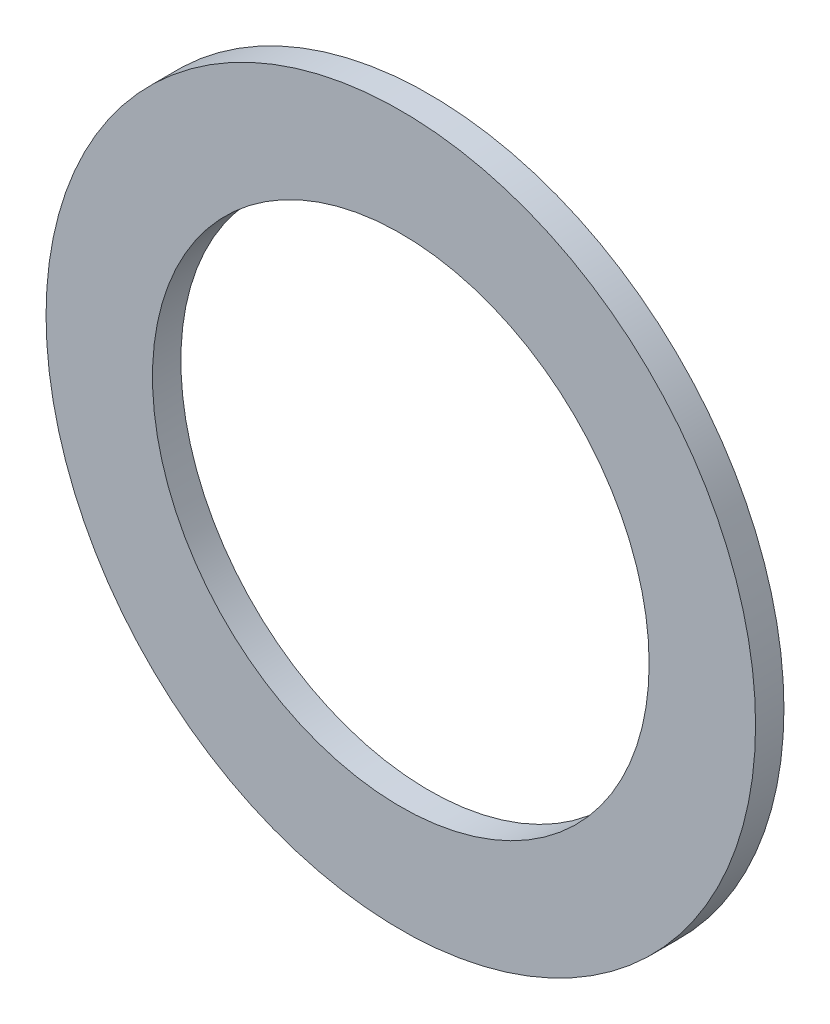
ISO-10303-21;
HEADER;
FILE_DESCRIPTION(('STEP AP214'),'2;1');
FILE_NAME('part.step','',(''),(''),'','','');
FILE_SCHEMA(('AUTOMOTIVE_DESIGN { 1 0 10303 214 1 1 1 1 }'));
ENDSEC;
DATA;
#1=APPLICATION_CONTEXT('core data for automotive mechanical design processes');
#2=APPLICATION_PROTOCOL_DEFINITION('international standard','automotive_design',2000,#1);
#3=PRODUCT_CONTEXT('',#1,'mechanical');
#4=PRODUCT('Part','Part','',(#3));
#5=PRODUCT_RELATED_PRODUCT_CATEGORY('part','',(#4));
#6=PRODUCT_DEFINITION_FORMATION('','',#4);
#7=PRODUCT_DEFINITION_CONTEXT('part definition',#1,'design');
#8=PRODUCT_DEFINITION('design','',#6,#7);
#9=PRODUCT_DEFINITION_SHAPE('','',#8);
#10=(LENGTH_UNIT() NAMED_UNIT(*) SI_UNIT(.MILLI.,.METRE.));
#11=(NAMED_UNIT(*) PLANE_ANGLE_UNIT() SI_UNIT($,.RADIAN.));
#12=(NAMED_UNIT(*) SI_UNIT($,.STERADIAN.) SOLID_ANGLE_UNIT());
#13=UNCERTAINTY_MEASURE_WITH_UNIT(LENGTH_MEASURE(1.E-05),#10,'distance_accuracy_value','');
#14=(GEOMETRIC_REPRESENTATION_CONTEXT(3) GLOBAL_UNCERTAINTY_ASSIGNED_CONTEXT((#13)) GLOBAL_UNIT_ASSIGNED_CONTEXT((#10,
#11,#12)) REPRESENTATION_CONTEXT('',''));
#15=CARTESIAN_POINT('',(0.,0.,0.));
#16=DIRECTION('',(0.,0.,1.));
#17=DIRECTION('',(1.,0.,0.));
#18=AXIS2_PLACEMENT_3D('',#15,#16,#17);
#19=CARTESIAN_POINT('',(0.,0.,0.2));
#20=DIRECTION('',(0.,0.,1.));
#21=DIRECTION('',(1.,0.,0.));
#22=AXIS2_PLACEMENT_3D('',#19,#20,#21);
#23=PLANE('',#22);
#24=CARTESIAN_POINT('',(0.,0.,0.2));
#25=DIRECTION('',(0.,0.,1.));
#26=DIRECTION('',(1.,0.,0.));
#27=AXIS2_PLACEMENT_3D('',#24,#25,#26);
#28=CIRCLE('',#27,2.5);
#29=CARTESIAN_POINT('',(2.5,0.,0.2));
#30=VERTEX_POINT('',#29);
#31=EDGE_CURVE('E10',#30,#30,#28,.T.);
#32=ORIENTED_EDGE('',*,*,#31,.T.);
#33=EDGE_LOOP('',(#32));
#34=FACE_BOUND('',#33,.T.);
#35=CARTESIAN_POINT('',(0.,0.,0.2));
#36=DIRECTION('',(0.,0.,1.));
#37=DIRECTION('',(1.,0.,0.));
#38=AXIS2_PLACEMENT_3D('',#35,#36,#37);
#39=CIRCLE('',#38,1.75);
#40=CARTESIAN_POINT('',(1.75,0.,0.2));
#41=VERTEX_POINT('',#40);
#42=EDGE_CURVE('E46',#41,#41,#39,.T.);
#43=ORIENTED_EDGE('',*,*,#42,.F.);
#44=EDGE_LOOP('',(#43));
#45=FACE_BOUND('',#44,.T.);
#46=ADVANCED_FACE('F35',(#34,#45),#23,.T.);
#47=CARTESIAN_POINT('',(0.,0.,0.));
#48=DIRECTION('',(0.,0.,1.));
#49=DIRECTION('',(1.,0.,0.));
#50=AXIS2_PLACEMENT_3D('',#47,#48,#49);
#51=PLANE('',#50);
#52=CARTESIAN_POINT('',(0.,0.,0.));
#53=DIRECTION('',(0.,0.,1.));
#54=DIRECTION('',(1.,0.,0.));
#55=AXIS2_PLACEMENT_3D('',#52,#53,#54);
#56=CIRCLE('',#55,2.5);
#57=CARTESIAN_POINT('',(2.5,0.,0.));
#58=VERTEX_POINT('',#57);
#59=EDGE_CURVE('E39',#58,#58,#56,.T.);
#60=ORIENTED_EDGE('',*,*,#59,.F.);
#61=EDGE_LOOP('',(#60));
#62=FACE_BOUND('',#61,.T.);
#63=CARTESIAN_POINT('',(0.,0.,0.));
#64=DIRECTION('',(0.,0.,1.));
#65=DIRECTION('',(1.,0.,0.));
#66=AXIS2_PLACEMENT_3D('',#63,#64,#65);
#67=CIRCLE('',#66,1.75);
#68=CARTESIAN_POINT('',(1.75,0.,0.));
#69=VERTEX_POINT('',#68);
#70=EDGE_CURVE('E48',#69,#69,#67,.T.);
#71=ORIENTED_EDGE('',*,*,#70,.T.);
#72=EDGE_LOOP('',(#71));
#73=FACE_BOUND('',#72,.T.);
#74=ADVANCED_FACE('F58',(#62,#73),#51,.F.);
#75=CARTESIAN_POINT('',(0.,0.,0.2));
#76=DIRECTION('',(0.,0.,-1.));
#77=DIRECTION('',(-1.,0.,0.));
#78=AXIS2_PLACEMENT_3D('',#75,#76,#77);
#79=CYLINDRICAL_SURFACE('',#78,2.5);
#80=ORIENTED_EDGE('',*,*,#31,.F.);
#81=EDGE_LOOP('',(#80));
#82=FACE_BOUND('',#81,.T.);
#83=ORIENTED_EDGE('',*,*,#59,.T.);
#84=EDGE_LOOP('',(#83));
#85=FACE_BOUND('',#84,.T.);
#86=ADVANCED_FACE('F37',(#82,#85),#79,.T.);
#87=CARTESIAN_POINT('',(0.,0.,0.2));
#88=DIRECTION('',(0.,0.,-1.));
#89=DIRECTION('',(-1.,0.,0.));
#90=AXIS2_PLACEMENT_3D('',#87,#88,#89);
#91=CYLINDRICAL_SURFACE('',#90,1.75);
#92=ORIENTED_EDGE('',*,*,#42,.T.);
#93=EDGE_LOOP('',(#92));
#94=FACE_BOUND('',#93,.T.);
#95=ORIENTED_EDGE('',*,*,#70,.F.);
#96=EDGE_LOOP('',(#95));
#97=FACE_BOUND('',#96,.T.);
#98=ADVANCED_FACE('F54',(#94,#97),#91,.F.);
#99=CLOSED_SHELL('',(#46,#74,#86,#98));
#100=MANIFOLD_SOLID_BREP('B2',#99);
#101=ADVANCED_BREP_SHAPE_REPRESENTATION('',(#18,#100),#14);
#102=SHAPE_DEFINITION_REPRESENTATION(#9,#101);
ENDSEC;
END-ISO-10303-21;
